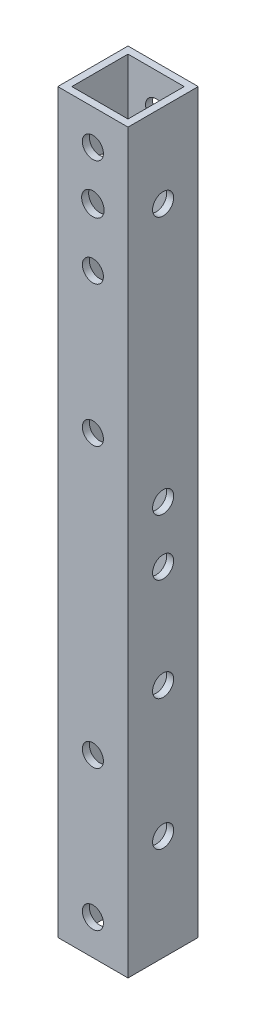
ISO-10303-21;
HEADER;
FILE_DESCRIPTION(('STEP AP214'),'2;1');
FILE_NAME('part.step','',(''),(''),'','','');
FILE_SCHEMA(('AUTOMOTIVE_DESIGN { 1 0 10303 214 1 1 1 1 }'));
ENDSEC;
DATA;
#1=APPLICATION_CONTEXT('core data for automotive mechanical design processes');
#2=APPLICATION_PROTOCOL_DEFINITION('international standard','automotive_design',2000,#1);
#3=PRODUCT_CONTEXT('',#1,'mechanical');
#4=PRODUCT('Part','Part','',(#3));
#5=PRODUCT_RELATED_PRODUCT_CATEGORY('part','',(#4));
#6=PRODUCT_DEFINITION_FORMATION('','',#4);
#7=PRODUCT_DEFINITION_CONTEXT('part definition',#1,'design');
#8=PRODUCT_DEFINITION('design','',#6,#7);
#9=PRODUCT_DEFINITION_SHAPE('','',#8);
#10=(LENGTH_UNIT() NAMED_UNIT(*) SI_UNIT(.MILLI.,.METRE.));
#11=(NAMED_UNIT(*) PLANE_ANGLE_UNIT() SI_UNIT($,.RADIAN.));
#12=(NAMED_UNIT(*) SI_UNIT($,.STERADIAN.) SOLID_ANGLE_UNIT());
#13=UNCERTAINTY_MEASURE_WITH_UNIT(LENGTH_MEASURE(1.E-05),#10,'distance_accuracy_value','');
#14=(GEOMETRIC_REPRESENTATION_CONTEXT(3) GLOBAL_UNCERTAINTY_ASSIGNED_CONTEXT((#13)) GLOBAL_UNIT_ASSIGNED_CONTEXT((#10,
#11,#12)) REPRESENTATION_CONTEXT('',''));
#15=CARTESIAN_POINT('',(0.,0.,0.));
#16=DIRECTION('',(0.,0.,1.));
#17=DIRECTION('',(1.,0.,0.));
#18=AXIS2_PLACEMENT_3D('',#15,#16,#17);
#19=CARTESIAN_POINT('',(0.,104.9,0.));
#20=DIRECTION('',(0.,1.,0.));
#21=DIRECTION('',(0.,0.,1.));
#22=AXIS2_PLACEMENT_3D('',#19,#20,#21);
#23=PLANE('',#22);
#24=DIRECTION('',(0.,0.,-1.));
#25=VECTOR('',#24,1.);
#26=CARTESIAN_POINT('',(5.,104.9,5.));
#27=LINE('',#26,#25);
#28=CARTESIAN_POINT('',(5.,104.9,5.));
#29=VERTEX_POINT('',#28);
#30=CARTESIAN_POINT('',(5.,104.9,-5.));
#31=VERTEX_POINT('',#30);
#32=EDGE_CURVE('E181',#29,#31,#27,.T.);
#33=ORIENTED_EDGE('',*,*,#32,.T.);
#34=DIRECTION('',(-1.,0.,0.));
#35=VECTOR('',#34,1.);
#36=CARTESIAN_POINT('',(-5.,104.9,-5.));
#37=LINE('',#36,#35);
#38=CARTESIAN_POINT('',(-5.,104.9,-5.));
#39=VERTEX_POINT('',#38);
#40=EDGE_CURVE('E185',#31,#39,#37,.T.);
#41=ORIENTED_EDGE('',*,*,#40,.T.);
#42=DIRECTION('',(0.,0.,1.));
#43=VECTOR('',#42,1.);
#44=CARTESIAN_POINT('',(-5.,104.9,5.));
#45=LINE('',#44,#43);
#46=CARTESIAN_POINT('',(-5.,104.9,5.));
#47=VERTEX_POINT('',#46);
#48=EDGE_CURVE('E189',#39,#47,#45,.T.);
#49=ORIENTED_EDGE('',*,*,#48,.T.);
#50=DIRECTION('',(1.,0.,0.));
#51=VECTOR('',#50,1.);
#52=CARTESIAN_POINT('',(-5.,104.9,5.));
#53=LINE('',#52,#51);
#54=EDGE_CURVE('E192',#47,#29,#53,.T.);
#55=ORIENTED_EDGE('',*,*,#54,.T.);
#56=EDGE_LOOP('',(#33,#41,#49,#55));
#57=FACE_BOUND('',#56,.T.);
#58=DIRECTION('',(-1.,0.,0.));
#59=VECTOR('',#58,1.);
#60=CARTESIAN_POINT('',(0.,104.9,-4.));
#61=LINE('',#60,#59);
#62=CARTESIAN_POINT('',(4.,104.9,-4.));
#63=VERTEX_POINT('',#62);
#64=CARTESIAN_POINT('',(-4.,104.9,-4.));
#65=VERTEX_POINT('',#64);
#66=EDGE_CURVE('E140',#63,#65,#61,.T.);
#67=ORIENTED_EDGE('',*,*,#66,.F.);
#68=DIRECTION('',(0.,0.,-1.));
#69=VECTOR('',#68,1.);
#70=CARTESIAN_POINT('',(4.,104.9,0.));
#71=LINE('',#70,#69);
#72=CARTESIAN_POINT('',(4.,104.9,4.));
#73=VERTEX_POINT('',#72);
#74=EDGE_CURVE('E131',#73,#63,#71,.T.);
#75=ORIENTED_EDGE('',*,*,#74,.F.);
#76=DIRECTION('',(1.,0.,0.));
#77=VECTOR('',#76,1.);
#78=CARTESIAN_POINT('',(0.,104.9,4.));
#79=LINE('',#78,#77);
#80=CARTESIAN_POINT('',(-4.,104.9,4.));
#81=VERTEX_POINT('',#80);
#82=EDGE_CURVE('E157',#81,#73,#79,.T.);
#83=ORIENTED_EDGE('',*,*,#82,.F.);
#84=DIRECTION('',(0.,0.,1.));
#85=VECTOR('',#84,1.);
#86=CARTESIAN_POINT('',(-4.,104.9,0.));
#87=LINE('',#86,#85);
#88=EDGE_CURVE('E153',#65,#81,#87,.T.);
#89=ORIENTED_EDGE('',*,*,#88,.F.);
#90=EDGE_LOOP('',(#67,#75,#83,#89));
#91=FACE_BOUND('',#90,.T.);
#92=ADVANCED_FACE('F63',(#57,#91),#23,.T.);
#93=CARTESIAN_POINT('',(0.,0.,0.));
#94=DIRECTION('',(0.,1.,0.));
#95=DIRECTION('',(0.,0.,1.));
#96=AXIS2_PLACEMENT_3D('',#93,#94,#95);
#97=PLANE('',#96);
#98=DIRECTION('',(0.,0.,-1.));
#99=VECTOR('',#98,1.);
#100=CARTESIAN_POINT('',(5.,0.,5.));
#101=LINE('',#100,#99);
#102=CARTESIAN_POINT('',(5.,0.,5.));
#103=VERTEX_POINT('',#102);
#104=CARTESIAN_POINT('',(5.,0.,-5.));
#105=VERTEX_POINT('',#104);
#106=EDGE_CURVE('E149',#103,#105,#101,.T.);
#107=ORIENTED_EDGE('',*,*,#106,.F.);
#108=DIRECTION('',(1.,0.,0.));
#109=VECTOR('',#108,1.);
#110=CARTESIAN_POINT('',(-5.,0.,5.));
#111=LINE('',#110,#109);
#112=CARTESIAN_POINT('',(-5.,0.,5.));
#113=VERTEX_POINT('',#112);
#114=EDGE_CURVE('E186',#113,#103,#111,.T.);
#115=ORIENTED_EDGE('',*,*,#114,.F.);
#116=DIRECTION('',(0.,0.,1.));
#117=VECTOR('',#116,1.);
#118=CARTESIAN_POINT('',(-5.,0.,5.));
#119=LINE('',#118,#117);
#120=CARTESIAN_POINT('',(-5.,0.,-5.));
#121=VERTEX_POINT('',#120);
#122=EDGE_CURVE('E202',#121,#113,#119,.T.);
#123=ORIENTED_EDGE('',*,*,#122,.F.);
#124=DIRECTION('',(-1.,0.,0.));
#125=VECTOR('',#124,1.);
#126=CARTESIAN_POINT('',(-5.,0.,-5.));
#127=LINE('',#126,#125);
#128=EDGE_CURVE('E199',#105,#121,#127,.T.);
#129=ORIENTED_EDGE('',*,*,#128,.F.);
#130=EDGE_LOOP('',(#107,#115,#123,#129));
#131=FACE_BOUND('',#130,.T.);
#132=DIRECTION('',(0.,0.,-1.));
#133=VECTOR('',#132,1.);
#134=CARTESIAN_POINT('',(4.,0.,0.));
#135=LINE('',#134,#133);
#136=CARTESIAN_POINT('',(4.,0.,4.));
#137=VERTEX_POINT('',#136);
#138=CARTESIAN_POINT('',(4.,0.,-4.));
#139=VERTEX_POINT('',#138);
#140=EDGE_CURVE('E89',#137,#139,#135,.T.);
#141=ORIENTED_EDGE('',*,*,#140,.T.);
#142=DIRECTION('',(-1.,0.,0.));
#143=VECTOR('',#142,1.);
#144=CARTESIAN_POINT('',(0.,0.,-4.));
#145=LINE('',#144,#143);
#146=CARTESIAN_POINT('',(-4.,0.,-4.));
#147=VERTEX_POINT('',#146);
#148=EDGE_CURVE('E147',#139,#147,#145,.T.);
#149=ORIENTED_EDGE('',*,*,#148,.T.);
#150=DIRECTION('',(0.,0.,1.));
#151=VECTOR('',#150,1.);
#152=CARTESIAN_POINT('',(-4.,0.,0.));
#153=LINE('',#152,#151);
#154=CARTESIAN_POINT('',(-4.,0.,4.));
#155=VERTEX_POINT('',#154);
#156=EDGE_CURVE('E168',#147,#155,#153,.T.);
#157=ORIENTED_EDGE('',*,*,#156,.T.);
#158=DIRECTION('',(1.,0.,0.));
#159=VECTOR('',#158,1.);
#160=CARTESIAN_POINT('',(0.,0.,4.));
#161=LINE('',#160,#159);
#162=EDGE_CURVE('E141',#155,#137,#161,.T.);
#163=ORIENTED_EDGE('',*,*,#162,.T.);
#164=EDGE_LOOP('',(#141,#149,#157,#163));
#165=FACE_BOUND('',#164,.T.);
#166=ADVANCED_FACE('F388',(#131,#165),#97,.F.);
#167=CARTESIAN_POINT('',(5.,104.9,5.));
#168=DIRECTION('',(-1.,0.,0.));
#169=DIRECTION('',(0.,0.,1.));
#170=AXIS2_PLACEMENT_3D('',#167,#168,#169);
#171=PLANE('',#170);
#172=CARTESIAN_POINT('',(5.,56.2,0.));
#173=DIRECTION('',(1.,0.,0.));
#174=DIRECTION('',(0.,0.,-1.));
#175=AXIS2_PLACEMENT_3D('',#172,#173,#174);
#176=CIRCLE('',#175,1.5);
#177=CARTESIAN_POINT('',(5.,56.2,-1.5));
#178=VERTEX_POINT('',#177);
#179=EDGE_CURVE('E479',#178,#178,#176,.T.);
#180=ORIENTED_EDGE('',*,*,#179,.F.);
#181=EDGE_LOOP('',(#180));
#182=FACE_BOUND('',#181,.T.);
#183=CARTESIAN_POINT('',(5.,15.,0.));
#184=DIRECTION('',(1.,0.,0.));
#185=DIRECTION('',(0.,0.,1.));
#186=AXIS2_PLACEMENT_3D('',#183,#184,#185);
#187=CIRCLE('',#186,1.5);
#188=CARTESIAN_POINT('',(5.,15.,1.5));
#189=VERTEX_POINT('',#188);
#190=EDGE_CURVE('E438',#189,#189,#187,.T.);
#191=ORIENTED_EDGE('',*,*,#190,.F.);
#192=EDGE_LOOP('',(#191));
#193=FACE_BOUND('',#192,.T.);
#194=CARTESIAN_POINT('',(5.,92.95,0.));
#195=DIRECTION('',(1.,0.,0.));
#196=DIRECTION('',(0.,0.,-1.));
#197=AXIS2_PLACEMENT_3D('',#194,#195,#196);
#198=CIRCLE('',#197,1.5);
#199=CARTESIAN_POINT('',(5.,92.95,-1.5));
#200=VERTEX_POINT('',#199);
#201=EDGE_CURVE('E473',#200,#200,#198,.T.);
#202=ORIENTED_EDGE('',*,*,#201,.F.);
#203=EDGE_LOOP('',(#202));
#204=FACE_BOUND('',#203,.T.);
#205=CARTESIAN_POINT('',(5.,33.6,0.));
#206=DIRECTION('',(1.,0.,0.));
#207=DIRECTION('',(0.,0.,-1.));
#208=AXIS2_PLACEMENT_3D('',#205,#206,#207);
#209=CIRCLE('',#208,1.5);
#210=CARTESIAN_POINT('',(5.,33.6,-1.5));
#211=VERTEX_POINT('',#210);
#212=EDGE_CURVE('E468',#211,#211,#209,.T.);
#213=ORIENTED_EDGE('',*,*,#212,.F.);
#214=EDGE_LOOP('',(#213));
#215=FACE_BOUND('',#214,.T.);
#216=CARTESIAN_POINT('',(5.,48.2,0.));
#217=DIRECTION('',(1.,0.,0.));
#218=DIRECTION('',(0.,0.,-1.));
#219=AXIS2_PLACEMENT_3D('',#216,#217,#218);
#220=CIRCLE('',#219,1.5);
#221=CARTESIAN_POINT('',(5.,48.2,-1.5));
#222=VERTEX_POINT('',#221);
#223=EDGE_CURVE('E432',#222,#222,#220,.T.);
#224=ORIENTED_EDGE('',*,*,#223,.F.);
#225=EDGE_LOOP('',(#224));
#226=FACE_BOUND('',#225,.T.);
#227=ORIENTED_EDGE('',*,*,#106,.T.);
#228=DIRECTION('',(0.,-1.,0.));
#229=VECTOR('',#228,1.);
#230=CARTESIAN_POINT('',(5.,104.9,-5.));
#231=LINE('',#230,#229);
#232=EDGE_CURVE('E12',#31,#105,#231,.T.);
#233=ORIENTED_EDGE('',*,*,#232,.F.);
#234=ORIENTED_EDGE('',*,*,#32,.F.);
#235=DIRECTION('',(0.,-1.,0.));
#236=VECTOR('',#235,1.);
#237=CARTESIAN_POINT('',(5.,104.9,5.));
#238=LINE('',#237,#236);
#239=EDGE_CURVE('E195',#29,#103,#238,.T.);
#240=ORIENTED_EDGE('',*,*,#239,.T.);
#241=EDGE_LOOP('',(#227,#233,#234,#240));
#242=FACE_BOUND('',#241,.T.);
#243=ADVANCED_FACE('F65',(#182,#193,#204,#215,#226,#242),#171,.F.);
#244=CARTESIAN_POINT('',(-5.,104.9,-5.));
#245=DIRECTION('',(0.,0.,1.));
#246=DIRECTION('',(1.,0.,0.));
#247=AXIS2_PLACEMENT_3D('',#244,#245,#246);
#248=PLANE('',#247);
#249=CARTESIAN_POINT('',(0.,5.00000000000002,-5.));
#250=DIRECTION('',(0.,0.,1.));
#251=DIRECTION('',(1.,0.,0.));
#252=AXIS2_PLACEMENT_3D('',#249,#250,#251);
#253=CIRCLE('',#252,1.5);
#254=CARTESIAN_POINT('',(1.5,5.00000000000002,-5.));
#255=VERTEX_POINT('',#254);
#256=EDGE_CURVE('E292',#255,#255,#253,.T.);
#257=ORIENTED_EDGE('',*,*,#256,.T.);
#258=EDGE_LOOP('',(#257));
#259=FACE_BOUND('',#258,.T.);
#260=CARTESIAN_POINT('',(0.,25.,-5.));
#261=DIRECTION('',(0.,0.,1.));
#262=DIRECTION('',(1.,0.,0.));
#263=AXIS2_PLACEMENT_3D('',#260,#261,#262);
#264=CIRCLE('',#263,1.5);
#265=CARTESIAN_POINT('',(1.5,25.,-5.));
#266=VERTEX_POINT('',#265);
#267=EDGE_CURVE('E301',#266,#266,#264,.T.);
#268=ORIENTED_EDGE('',*,*,#267,.T.);
#269=EDGE_LOOP('',(#268));
#270=FACE_BOUND('',#269,.T.);
#271=CARTESIAN_POINT('',(0.,64.7,-5.));
#272=DIRECTION('',(0.,0.,1.));
#273=DIRECTION('',(1.,0.,0.));
#274=AXIS2_PLACEMENT_3D('',#271,#272,#273);
#275=CIRCLE('',#274,1.5);
#276=CARTESIAN_POINT('',(1.5,64.7,-5.));
#277=VERTEX_POINT('',#276);
#278=EDGE_CURVE('E309',#277,#277,#275,.T.);
#279=ORIENTED_EDGE('',*,*,#278,.T.);
#280=EDGE_LOOP('',(#279));
#281=FACE_BOUND('',#280,.T.);
#282=CARTESIAN_POINT('',(0.,99.9,-5.));
#283=DIRECTION('',(0.,0.,1.));
#284=DIRECTION('',(1.,0.,0.));
#285=AXIS2_PLACEMENT_3D('',#282,#283,#284);
#286=CIRCLE('',#285,1.5);
#287=CARTESIAN_POINT('',(1.5,99.9,-5.));
#288=VERTEX_POINT('',#287);
#289=EDGE_CURVE('E317',#288,#288,#286,.T.);
#290=ORIENTED_EDGE('',*,*,#289,.T.);
#291=EDGE_LOOP('',(#290));
#292=FACE_BOUND('',#291,.T.);
#293=CARTESIAN_POINT('',(0.,92.95,-5.));
#294=DIRECTION('',(0.,0.,1.));
#295=DIRECTION('',(1.,0.,0.));
#296=AXIS2_PLACEMENT_3D('',#293,#294,#295);
#297=CIRCLE('',#296,1.6);
#298=CARTESIAN_POINT('',(1.6,92.95,-5.));
#299=VERTEX_POINT('',#298);
#300=EDGE_CURVE('E284',#299,#299,#297,.T.);
#301=ORIENTED_EDGE('',*,*,#300,.T.);
#302=EDGE_LOOP('',(#301));
#303=FACE_BOUND('',#302,.T.);
#304=CARTESIAN_POINT('',(0.,84.7,-5.));
#305=DIRECTION('',(0.,0.,1.));
#306=DIRECTION('',(1.,0.,0.));
#307=AXIS2_PLACEMENT_3D('',#304,#305,#306);
#308=CIRCLE('',#307,1.5);
#309=CARTESIAN_POINT('',(1.5,84.7,-5.));
#310=VERTEX_POINT('',#309);
#311=EDGE_CURVE('E222',#310,#310,#308,.T.);
#312=ORIENTED_EDGE('',*,*,#311,.T.);
#313=EDGE_LOOP('',(#312));
#314=FACE_BOUND('',#313,.T.);
#315=ORIENTED_EDGE('',*,*,#128,.T.);
#316=DIRECTION('',(0.,-1.,0.));
#317=VECTOR('',#316,1.);
#318=CARTESIAN_POINT('',(-5.,104.9,-5.));
#319=LINE('',#318,#317);
#320=EDGE_CURVE('E73',#39,#121,#319,.T.);
#321=ORIENTED_EDGE('',*,*,#320,.F.);
#322=ORIENTED_EDGE('',*,*,#40,.F.);
#323=ORIENTED_EDGE('',*,*,#232,.T.);
#324=EDGE_LOOP('',(#315,#321,#322,#323));
#325=FACE_BOUND('',#324,.T.);
#326=ADVANCED_FACE('F374',(#259,#270,#281,#292,#303,#314,#325),#248,.F.);
#327=CARTESIAN_POINT('',(-5.,104.9,5.));
#328=DIRECTION('',(1.,0.,0.));
#329=DIRECTION('',(0.,0.,-1.));
#330=AXIS2_PLACEMENT_3D('',#327,#328,#329);
#331=PLANE('',#330);
#332=CARTESIAN_POINT('',(-5.,56.2,0.));
#333=DIRECTION('',(1.,0.,0.));
#334=DIRECTION('',(0.,0.,-1.));
#335=AXIS2_PLACEMENT_3D('',#332,#333,#334);
#336=CIRCLE('',#335,1.5);
#337=CARTESIAN_POINT('',(-5.,56.2,-1.5));
#338=VERTEX_POINT('',#337);
#339=EDGE_CURVE('E415',#338,#338,#336,.T.);
#340=ORIENTED_EDGE('',*,*,#339,.T.);
#341=EDGE_LOOP('',(#340));
#342=FACE_BOUND('',#341,.T.);
#343=CARTESIAN_POINT('',(-5.,15.,0.));
#344=DIRECTION('',(1.,0.,0.));
#345=DIRECTION('',(0.,0.,1.));
#346=AXIS2_PLACEMENT_3D('',#343,#344,#345);
#347=CIRCLE('',#346,1.5);
#348=CARTESIAN_POINT('',(-5.,15.,1.5));
#349=VERTEX_POINT('',#348);
#350=EDGE_CURVE('E419',#349,#349,#347,.T.);
#351=ORIENTED_EDGE('',*,*,#350,.T.);
#352=EDGE_LOOP('',(#351));
#353=FACE_BOUND('',#352,.T.);
#354=CARTESIAN_POINT('',(-5.,92.95,0.));
#355=DIRECTION('',(1.,0.,0.));
#356=DIRECTION('',(0.,0.,-1.));
#357=AXIS2_PLACEMENT_3D('',#354,#355,#356);
#358=CIRCLE('',#357,1.5);
#359=CARTESIAN_POINT('',(-5.,92.95,-1.5));
#360=VERTEX_POINT('',#359);
#361=EDGE_CURVE('E423',#360,#360,#358,.T.);
#362=ORIENTED_EDGE('',*,*,#361,.T.);
#363=EDGE_LOOP('',(#362));
#364=FACE_BOUND('',#363,.T.);
#365=CARTESIAN_POINT('',(-5.,33.6,0.));
#366=DIRECTION('',(1.,0.,0.));
#367=DIRECTION('',(0.,0.,-1.));
#368=AXIS2_PLACEMENT_3D('',#365,#366,#367);
#369=CIRCLE('',#368,1.5);
#370=CARTESIAN_POINT('',(-5.,33.6,-1.5));
#371=VERTEX_POINT('',#370);
#372=EDGE_CURVE('E427',#371,#371,#369,.T.);
#373=ORIENTED_EDGE('',*,*,#372,.T.);
#374=EDGE_LOOP('',(#373));
#375=FACE_BOUND('',#374,.T.);
#376=CARTESIAN_POINT('',(-5.,48.2,0.));
#377=DIRECTION('',(1.,0.,0.));
#378=DIRECTION('',(0.,0.,-1.));
#379=AXIS2_PLACEMENT_3D('',#376,#377,#378);
#380=CIRCLE('',#379,1.5);
#381=CARTESIAN_POINT('',(-5.,48.2,-1.5));
#382=VERTEX_POINT('',#381);
#383=EDGE_CURVE('E252',#382,#382,#380,.T.);
#384=ORIENTED_EDGE('',*,*,#383,.T.);
#385=EDGE_LOOP('',(#384));
#386=FACE_BOUND('',#385,.T.);
#387=ORIENTED_EDGE('',*,*,#122,.T.);
#388=DIRECTION('',(0.,-1.,0.));
#389=VECTOR('',#388,1.);
#390=CARTESIAN_POINT('',(-5.,104.9,5.));
#391=LINE('',#390,#389);
#392=EDGE_CURVE('E210',#47,#113,#391,.T.);
#393=ORIENTED_EDGE('',*,*,#392,.F.);
#394=ORIENTED_EDGE('',*,*,#48,.F.);
#395=ORIENTED_EDGE('',*,*,#320,.T.);
#396=EDGE_LOOP('',(#387,#393,#394,#395));
#397=FACE_BOUND('',#396,.T.);
#398=ADVANCED_FACE('F377',(#342,#353,#364,#375,#386,#397),#331,.F.);
#399=CARTESIAN_POINT('',(-5.,104.9,5.));
#400=DIRECTION('',(0.,0.,-1.));
#401=DIRECTION('',(-1.,0.,0.));
#402=AXIS2_PLACEMENT_3D('',#399,#400,#401);
#403=PLANE('',#402);
#404=CARTESIAN_POINT('',(0.,5.00000000000002,5.));
#405=DIRECTION('',(0.,0.,1.));
#406=DIRECTION('',(1.,0.,0.));
#407=AXIS2_PLACEMENT_3D('',#404,#405,#406);
#408=CIRCLE('',#407,1.5);
#409=CARTESIAN_POINT('',(1.5,5.00000000000002,5.));
#410=VERTEX_POINT('',#409);
#411=EDGE_CURVE('E297',#410,#410,#408,.T.);
#412=ORIENTED_EDGE('',*,*,#411,.F.);
#413=EDGE_LOOP('',(#412));
#414=FACE_BOUND('',#413,.T.);
#415=CARTESIAN_POINT('',(0.,25.,5.));
#416=DIRECTION('',(0.,0.,1.));
#417=DIRECTION('',(1.,0.,0.));
#418=AXIS2_PLACEMENT_3D('',#415,#416,#417);
#419=CIRCLE('',#418,1.5);
#420=CARTESIAN_POINT('',(1.5,25.,5.));
#421=VERTEX_POINT('',#420);
#422=EDGE_CURVE('E305',#421,#421,#419,.T.);
#423=ORIENTED_EDGE('',*,*,#422,.F.);
#424=EDGE_LOOP('',(#423));
#425=FACE_BOUND('',#424,.T.);
#426=CARTESIAN_POINT('',(0.,64.7,5.));
#427=DIRECTION('',(0.,0.,1.));
#428=DIRECTION('',(1.,0.,0.));
#429=AXIS2_PLACEMENT_3D('',#426,#427,#428);
#430=CIRCLE('',#429,1.5);
#431=CARTESIAN_POINT('',(1.5,64.7,5.));
#432=VERTEX_POINT('',#431);
#433=EDGE_CURVE('E313',#432,#432,#430,.T.);
#434=ORIENTED_EDGE('',*,*,#433,.F.);
#435=EDGE_LOOP('',(#434));
#436=FACE_BOUND('',#435,.T.);
#437=CARTESIAN_POINT('',(0.,99.9,5.));
#438=DIRECTION('',(0.,0.,1.));
#439=DIRECTION('',(1.,0.,0.));
#440=AXIS2_PLACEMENT_3D('',#437,#438,#439);
#441=CIRCLE('',#440,1.5);
#442=CARTESIAN_POINT('',(1.5,99.9,5.));
#443=VERTEX_POINT('',#442);
#444=EDGE_CURVE('E288',#443,#443,#441,.T.);
#445=ORIENTED_EDGE('',*,*,#444,.F.);
#446=EDGE_LOOP('',(#445));
#447=FACE_BOUND('',#446,.T.);
#448=CARTESIAN_POINT('',(0.,92.95,5.));
#449=DIRECTION('',(0.,0.,1.));
#450=DIRECTION('',(1.,0.,0.));
#451=AXIS2_PLACEMENT_3D('',#448,#449,#450);
#452=CIRCLE('',#451,1.6);
#453=CARTESIAN_POINT('',(1.6,92.95,5.));
#454=VERTEX_POINT('',#453);
#455=EDGE_CURVE('E283',#454,#454,#452,.T.);
#456=ORIENTED_EDGE('',*,*,#455,.F.);
#457=EDGE_LOOP('',(#456));
#458=FACE_BOUND('',#457,.T.);
#459=CARTESIAN_POINT('',(0.,84.7,5.));
#460=DIRECTION('',(0.,0.,1.));
#461=DIRECTION('',(1.,0.,0.));
#462=AXIS2_PLACEMENT_3D('',#459,#460,#461);
#463=CIRCLE('',#462,1.5);
#464=CARTESIAN_POINT('',(1.5,84.7,5.));
#465=VERTEX_POINT('',#464);
#466=EDGE_CURVE('E296',#465,#465,#463,.T.);
#467=ORIENTED_EDGE('',*,*,#466,.F.);
#468=EDGE_LOOP('',(#467));
#469=FACE_BOUND('',#468,.T.);
#470=ORIENTED_EDGE('',*,*,#114,.T.);
#471=ORIENTED_EDGE('',*,*,#239,.F.);
#472=ORIENTED_EDGE('',*,*,#54,.F.);
#473=ORIENTED_EDGE('',*,*,#392,.T.);
#474=EDGE_LOOP('',(#470,#471,#472,#473));
#475=FACE_BOUND('',#474,.T.);
#476=ADVANCED_FACE('F392',(#414,#425,#436,#447,#458,#469,#475),#403,.F.);
#477=CARTESIAN_POINT('',(4.,104.9,0.));
#478=DIRECTION('',(-1.,0.,0.));
#479=DIRECTION('',(0.,0.,1.));
#480=AXIS2_PLACEMENT_3D('',#477,#478,#479);
#481=PLANE('',#480);
#482=CARTESIAN_POINT('',(4.,56.2,0.));
#483=DIRECTION('',(-1.,0.,0.));
#484=DIRECTION('',(0.,0.,1.));
#485=AXIS2_PLACEMENT_3D('',#482,#483,#484);
#486=CIRCLE('',#485,1.5);
#487=CARTESIAN_POINT('',(4.,56.2,1.5));
#488=VERTEX_POINT('',#487);
#489=EDGE_CURVE('E279',#488,#488,#486,.T.);
#490=ORIENTED_EDGE('',*,*,#489,.F.);
#491=EDGE_LOOP('',(#490));
#492=FACE_BOUND('',#491,.T.);
#493=CARTESIAN_POINT('',(4.,15.,0.));
#494=DIRECTION('',(-1.,0.,0.));
#495=DIRECTION('',(0.,0.,1.));
#496=AXIS2_PLACEMENT_3D('',#493,#494,#495);
#497=CIRCLE('',#496,1.5);
#498=CARTESIAN_POINT('',(4.,15.,1.5));
#499=VERTEX_POINT('',#498);
#500=EDGE_CURVE('E265',#499,#499,#497,.T.);
#501=ORIENTED_EDGE('',*,*,#500,.F.);
#502=EDGE_LOOP('',(#501));
#503=FACE_BOUND('',#502,.T.);
#504=CARTESIAN_POINT('',(4.,92.95,0.));
#505=DIRECTION('',(-1.,0.,0.));
#506=DIRECTION('',(0.,0.,1.));
#507=AXIS2_PLACEMENT_3D('',#504,#505,#506);
#508=CIRCLE('',#507,1.5);
#509=CARTESIAN_POINT('',(4.,92.95,1.5));
#510=VERTEX_POINT('',#509);
#511=EDGE_CURVE('E261',#510,#510,#508,.T.);
#512=ORIENTED_EDGE('',*,*,#511,.F.);
#513=EDGE_LOOP('',(#512));
#514=FACE_BOUND('',#513,.T.);
#515=CARTESIAN_POINT('',(4.,33.6,0.));
#516=DIRECTION('',(-1.,0.,0.));
#517=DIRECTION('',(0.,0.,1.));
#518=AXIS2_PLACEMENT_3D('',#515,#516,#517);
#519=CIRCLE('',#518,1.5);
#520=CARTESIAN_POINT('',(4.,33.6,1.5));
#521=VERTEX_POINT('',#520);
#522=EDGE_CURVE('E257',#521,#521,#519,.T.);
#523=ORIENTED_EDGE('',*,*,#522,.F.);
#524=EDGE_LOOP('',(#523));
#525=FACE_BOUND('',#524,.T.);
#526=CARTESIAN_POINT('',(4.,48.2,0.));
#527=DIRECTION('',(-1.,0.,0.));
#528=DIRECTION('',(0.,0.,1.));
#529=AXIS2_PLACEMENT_3D('',#526,#527,#528);
#530=CIRCLE('',#529,1.5);
#531=CARTESIAN_POINT('',(4.,48.2,1.5));
#532=VERTEX_POINT('',#531);
#533=EDGE_CURVE('E251',#532,#532,#530,.T.);
#534=ORIENTED_EDGE('',*,*,#533,.F.);
#535=EDGE_LOOP('',(#534));
#536=FACE_BOUND('',#535,.T.);
#537=ORIENTED_EDGE('',*,*,#140,.F.);
#538=DIRECTION('',(0.,-1.,0.));
#539=VECTOR('',#538,1.);
#540=CARTESIAN_POINT('',(4.,104.9,4.));
#541=LINE('',#540,#539);
#542=EDGE_CURVE('E135',#73,#137,#541,.T.);
#543=ORIENTED_EDGE('',*,*,#542,.F.);
#544=ORIENTED_EDGE('',*,*,#74,.T.);
#545=DIRECTION('',(0.,-1.,0.));
#546=VECTOR('',#545,1.);
#547=CARTESIAN_POINT('',(4.,104.9,-4.));
#548=LINE('',#547,#546);
#549=EDGE_CURVE('E134',#63,#139,#548,.T.);
#550=ORIENTED_EDGE('',*,*,#549,.T.);
#551=EDGE_LOOP('',(#537,#543,#544,#550));
#552=FACE_BOUND('',#551,.T.);
#553=ADVANCED_FACE('F133',(#492,#503,#514,#525,#536,#552),#481,.T.);
#554=CARTESIAN_POINT('',(0.,104.9,-4.));
#555=DIRECTION('',(0.,0.,1.));
#556=DIRECTION('',(1.,0.,0.));
#557=AXIS2_PLACEMENT_3D('',#554,#555,#556);
#558=PLANE('',#557);
#559=CARTESIAN_POINT('',(0.,5.00000000000002,-4.));
#560=DIRECTION('',(0.,0.,1.));
#561=DIRECTION('',(1.,0.,0.));
#562=AXIS2_PLACEMENT_3D('',#559,#560,#561);
#563=CIRCLE('',#562,1.5);
#564=CARTESIAN_POINT('',(1.5,5.00000000000002,-4.));
#565=VERTEX_POINT('',#564);
#566=EDGE_CURVE('E165',#565,#565,#563,.T.);
#567=ORIENTED_EDGE('',*,*,#566,.F.);
#568=EDGE_LOOP('',(#567));
#569=FACE_BOUND('',#568,.T.);
#570=CARTESIAN_POINT('',(0.,25.,-4.));
#571=DIRECTION('',(0.,0.,1.));
#572=DIRECTION('',(1.,0.,0.));
#573=AXIS2_PLACEMENT_3D('',#570,#571,#572);
#574=CIRCLE('',#573,1.5);
#575=CARTESIAN_POINT('',(1.5,25.,-4.));
#576=VERTEX_POINT('',#575);
#577=EDGE_CURVE('E242',#576,#576,#574,.T.);
#578=ORIENTED_EDGE('',*,*,#577,.F.);
#579=EDGE_LOOP('',(#578));
#580=FACE_BOUND('',#579,.T.);
#581=CARTESIAN_POINT('',(0.,64.7,-4.));
#582=DIRECTION('',(0.,0.,1.));
#583=DIRECTION('',(1.,0.,0.));
#584=AXIS2_PLACEMENT_3D('',#581,#582,#583);
#585=CIRCLE('',#584,1.5);
#586=CARTESIAN_POINT('',(1.5,64.7,-4.));
#587=VERTEX_POINT('',#586);
#588=EDGE_CURVE('E237',#587,#587,#585,.T.);
#589=ORIENTED_EDGE('',*,*,#588,.F.);
#590=EDGE_LOOP('',(#589));
#591=FACE_BOUND('',#590,.T.);
#592=CARTESIAN_POINT('',(0.,99.9,-4.));
#593=DIRECTION('',(0.,0.,1.));
#594=DIRECTION('',(1.,0.,0.));
#595=AXIS2_PLACEMENT_3D('',#592,#593,#594);
#596=CIRCLE('',#595,1.5);
#597=CARTESIAN_POINT('',(1.5,99.9,-4.));
#598=VERTEX_POINT('',#597);
#599=EDGE_CURVE('E232',#598,#598,#596,.T.);
#600=ORIENTED_EDGE('',*,*,#599,.F.);
#601=EDGE_LOOP('',(#600));
#602=FACE_BOUND('',#601,.T.);
#603=CARTESIAN_POINT('',(0.,92.95,-4.));
#604=DIRECTION('',(0.,0.,1.));
#605=DIRECTION('',(1.,0.,0.));
#606=AXIS2_PLACEMENT_3D('',#603,#604,#605);
#607=CIRCLE('',#606,1.6);
#608=CARTESIAN_POINT('',(1.6,92.95,-4.));
#609=VERTEX_POINT('',#608);
#610=EDGE_CURVE('E227',#609,#609,#607,.T.);
#611=ORIENTED_EDGE('',*,*,#610,.F.);
#612=EDGE_LOOP('',(#611));
#613=FACE_BOUND('',#612,.T.);
#614=CARTESIAN_POINT('',(0.,84.7,-4.));
#615=DIRECTION('',(0.,0.,1.));
#616=DIRECTION('',(1.,0.,0.));
#617=AXIS2_PLACEMENT_3D('',#614,#615,#616);
#618=CIRCLE('',#617,1.5);
#619=CARTESIAN_POINT('',(1.5,84.7,-4.));
#620=VERTEX_POINT('',#619);
#621=EDGE_CURVE('E221',#620,#620,#618,.T.);
#622=ORIENTED_EDGE('',*,*,#621,.F.);
#623=EDGE_LOOP('',(#622));
#624=FACE_BOUND('',#623,.T.);
#625=ORIENTED_EDGE('',*,*,#148,.F.);
#626=ORIENTED_EDGE('',*,*,#549,.F.);
#627=ORIENTED_EDGE('',*,*,#66,.T.);
#628=DIRECTION('',(0.,-1.,0.));
#629=VECTOR('',#628,1.);
#630=CARTESIAN_POINT('',(-4.,104.9,-4.));
#631=LINE('',#630,#629);
#632=EDGE_CURVE('E150',#65,#147,#631,.T.);
#633=ORIENTED_EDGE('',*,*,#632,.T.);
#634=EDGE_LOOP('',(#625,#626,#627,#633));
#635=FACE_BOUND('',#634,.T.);
#636=ADVANCED_FACE('F144',(#569,#580,#591,#602,#613,#624,#635),#558,.T.);
#637=CARTESIAN_POINT('',(-4.,104.9,0.));
#638=DIRECTION('',(1.,0.,0.));
#639=DIRECTION('',(0.,0.,-1.));
#640=AXIS2_PLACEMENT_3D('',#637,#638,#639);
#641=PLANE('',#640);
#642=CARTESIAN_POINT('',(-4.,56.2,0.));
#643=DIRECTION('',(1.,0.,0.));
#644=DIRECTION('',(0.,0.,-1.));
#645=AXIS2_PLACEMENT_3D('',#642,#643,#644);
#646=CIRCLE('',#645,1.5);
#647=CARTESIAN_POINT('',(-4.,56.2,-1.5));
#648=VERTEX_POINT('',#647);
#649=EDGE_CURVE('E67',#648,#648,#646,.T.);
#650=ORIENTED_EDGE('',*,*,#649,.F.);
#651=EDGE_LOOP('',(#650));
#652=FACE_BOUND('',#651,.T.);
#653=CARTESIAN_POINT('',(-4.,15.,0.));
#654=DIRECTION('',(1.,0.,0.));
#655=DIRECTION('',(0.,0.,-1.));
#656=AXIS2_PLACEMENT_3D('',#653,#654,#655);
#657=CIRCLE('',#656,1.5);
#658=CARTESIAN_POINT('',(-4.,15.,-1.5));
#659=VERTEX_POINT('',#658);
#660=EDGE_CURVE('E262',#659,#659,#657,.T.);
#661=ORIENTED_EDGE('',*,*,#660,.F.);
#662=EDGE_LOOP('',(#661));
#663=FACE_BOUND('',#662,.T.);
#664=CARTESIAN_POINT('',(-4.,92.95,0.));
#665=DIRECTION('',(1.,0.,0.));
#666=DIRECTION('',(0.,0.,-1.));
#667=AXIS2_PLACEMENT_3D('',#664,#665,#666);
#668=CIRCLE('',#667,1.5);
#669=CARTESIAN_POINT('',(-4.,92.95,-1.5));
#670=VERTEX_POINT('',#669);
#671=EDGE_CURVE('E258',#670,#670,#668,.T.);
#672=ORIENTED_EDGE('',*,*,#671,.F.);
#673=EDGE_LOOP('',(#672));
#674=FACE_BOUND('',#673,.T.);
#675=CARTESIAN_POINT('',(-4.,33.6,0.));
#676=DIRECTION('',(1.,0.,0.));
#677=DIRECTION('',(0.,0.,-1.));
#678=AXIS2_PLACEMENT_3D('',#675,#676,#677);
#679=CIRCLE('',#678,1.5);
#680=CARTESIAN_POINT('',(-4.,33.6,-1.5));
#681=VERTEX_POINT('',#680);
#682=EDGE_CURVE('E253',#681,#681,#679,.T.);
#683=ORIENTED_EDGE('',*,*,#682,.F.);
#684=EDGE_LOOP('',(#683));
#685=FACE_BOUND('',#684,.T.);
#686=CARTESIAN_POINT('',(-4.,48.2,0.));
#687=DIRECTION('',(1.,0.,0.));
#688=DIRECTION('',(0.,0.,-1.));
#689=AXIS2_PLACEMENT_3D('',#686,#687,#688);
#690=CIRCLE('',#689,1.5);
#691=CARTESIAN_POINT('',(-4.,48.2,-1.5));
#692=VERTEX_POINT('',#691);
#693=EDGE_CURVE('E247',#692,#692,#690,.T.);
#694=ORIENTED_EDGE('',*,*,#693,.F.);
#695=EDGE_LOOP('',(#694));
#696=FACE_BOUND('',#695,.T.);
#697=ORIENTED_EDGE('',*,*,#156,.F.);
#698=ORIENTED_EDGE('',*,*,#632,.F.);
#699=ORIENTED_EDGE('',*,*,#88,.T.);
#700=DIRECTION('',(0.,-1.,0.));
#701=VECTOR('',#700,1.);
#702=CARTESIAN_POINT('',(-4.,104.9,4.));
#703=LINE('',#702,#701);
#704=EDGE_CURVE('E81',#81,#155,#703,.T.);
#705=ORIENTED_EDGE('',*,*,#704,.T.);
#706=EDGE_LOOP('',(#697,#698,#699,#705));
#707=FACE_BOUND('',#706,.T.);
#708=ADVANCED_FACE('F353',(#652,#663,#674,#685,#696,#707),#641,.T.);
#709=CARTESIAN_POINT('',(0.,104.9,4.));
#710=DIRECTION('',(0.,0.,-1.));
#711=DIRECTION('',(-1.,0.,0.));
#712=AXIS2_PLACEMENT_3D('',#709,#710,#711);
#713=PLANE('',#712);
#714=CARTESIAN_POINT('',(0.,5.00000000000002,4.));
#715=DIRECTION('',(0.,0.,-1.));
#716=DIRECTION('',(-1.,0.,0.));
#717=AXIS2_PLACEMENT_3D('',#714,#715,#716);
#718=CIRCLE('',#717,1.5);
#719=CARTESIAN_POINT('',(-1.5,5.00000000000002,4.));
#720=VERTEX_POINT('',#719);
#721=EDGE_CURVE('E243',#720,#720,#718,.T.);
#722=ORIENTED_EDGE('',*,*,#721,.F.);
#723=EDGE_LOOP('',(#722));
#724=FACE_BOUND('',#723,.T.);
#725=CARTESIAN_POINT('',(0.,25.,4.));
#726=DIRECTION('',(0.,0.,-1.));
#727=DIRECTION('',(-1.,0.,0.));
#728=AXIS2_PLACEMENT_3D('',#725,#726,#727);
#729=CIRCLE('',#728,1.5);
#730=CARTESIAN_POINT('',(-1.5,25.,4.));
#731=VERTEX_POINT('',#730);
#732=EDGE_CURVE('E238',#731,#731,#729,.T.);
#733=ORIENTED_EDGE('',*,*,#732,.F.);
#734=EDGE_LOOP('',(#733));
#735=FACE_BOUND('',#734,.T.);
#736=CARTESIAN_POINT('',(0.,64.7,4.));
#737=DIRECTION('',(0.,0.,-1.));
#738=DIRECTION('',(-1.,0.,0.));
#739=AXIS2_PLACEMENT_3D('',#736,#737,#738);
#740=CIRCLE('',#739,1.5);
#741=CARTESIAN_POINT('',(-1.5,64.7,4.));
#742=VERTEX_POINT('',#741);
#743=EDGE_CURVE('E233',#742,#742,#740,.T.);
#744=ORIENTED_EDGE('',*,*,#743,.F.);
#745=EDGE_LOOP('',(#744));
#746=FACE_BOUND('',#745,.T.);
#747=CARTESIAN_POINT('',(0.,99.9,4.));
#748=DIRECTION('',(0.,0.,-1.));
#749=DIRECTION('',(-1.,0.,0.));
#750=AXIS2_PLACEMENT_3D('',#747,#748,#749);
#751=CIRCLE('',#750,1.5);
#752=CARTESIAN_POINT('',(-1.5,99.9,4.));
#753=VERTEX_POINT('',#752);
#754=EDGE_CURVE('E228',#753,#753,#751,.T.);
#755=ORIENTED_EDGE('',*,*,#754,.F.);
#756=EDGE_LOOP('',(#755));
#757=FACE_BOUND('',#756,.T.);
#758=CARTESIAN_POINT('',(0.,92.95,4.));
#759=DIRECTION('',(0.,0.,-1.));
#760=DIRECTION('',(-1.,0.,0.));
#761=AXIS2_PLACEMENT_3D('',#758,#759,#760);
#762=CIRCLE('',#761,1.6);
#763=CARTESIAN_POINT('',(-1.6,92.95,4.));
#764=VERTEX_POINT('',#763);
#765=EDGE_CURVE('E223',#764,#764,#762,.T.);
#766=ORIENTED_EDGE('',*,*,#765,.F.);
#767=EDGE_LOOP('',(#766));
#768=FACE_BOUND('',#767,.T.);
#769=CARTESIAN_POINT('',(0.,84.7,4.));
#770=DIRECTION('',(0.,0.,-1.));
#771=DIRECTION('',(-1.,0.,0.));
#772=AXIS2_PLACEMENT_3D('',#769,#770,#771);
#773=CIRCLE('',#772,1.5);
#774=CARTESIAN_POINT('',(-1.5,84.7,4.));
#775=VERTEX_POINT('',#774);
#776=EDGE_CURVE('E217',#775,#775,#773,.T.);
#777=ORIENTED_EDGE('',*,*,#776,.F.);
#778=EDGE_LOOP('',(#777));
#779=FACE_BOUND('',#778,.T.);
#780=ORIENTED_EDGE('',*,*,#162,.F.);
#781=ORIENTED_EDGE('',*,*,#704,.F.);
#782=ORIENTED_EDGE('',*,*,#82,.T.);
#783=ORIENTED_EDGE('',*,*,#542,.T.);
#784=EDGE_LOOP('',(#780,#781,#782,#783));
#785=FACE_BOUND('',#784,.T.);
#786=ADVANCED_FACE('F525',(#724,#735,#746,#757,#768,#779,#785),#713,.T.);
#787=CARTESIAN_POINT('',(0.,84.7,-5.));
#788=DIRECTION('',(0.,0.,1.));
#789=DIRECTION('',(1.,0.,0.));
#790=AXIS2_PLACEMENT_3D('',#787,#788,#789);
#791=CYLINDRICAL_SURFACE('',#790,1.5);
#792=ORIENTED_EDGE('',*,*,#776,.T.);
#793=EDGE_LOOP('',(#792));
#794=FACE_BOUND('',#793,.T.);
#795=ORIENTED_EDGE('',*,*,#466,.T.);
#796=EDGE_LOOP('',(#795));
#797=FACE_BOUND('',#796,.T.);
#798=ADVANCED_FACE('F371',(#794,#797),#791,.F.);
#799=CARTESIAN_POINT('',(0.,92.95,-5.));
#800=DIRECTION('',(0.,0.,1.));
#801=DIRECTION('',(1.,0.,0.));
#802=AXIS2_PLACEMENT_3D('',#799,#800,#801);
#803=CYLINDRICAL_SURFACE('',#802,1.6);
#804=ORIENTED_EDGE('',*,*,#765,.T.);
#805=EDGE_LOOP('',(#804));
#806=FACE_BOUND('',#805,.T.);
#807=ORIENTED_EDGE('',*,*,#455,.T.);
#808=EDGE_LOOP('',(#807));
#809=FACE_BOUND('',#808,.T.);
#810=ADVANCED_FACE('F535',(#806,#809),#803,.F.);
#811=CARTESIAN_POINT('',(0.,99.9,-5.));
#812=DIRECTION('',(0.,0.,1.));
#813=DIRECTION('',(1.,0.,0.));
#814=AXIS2_PLACEMENT_3D('',#811,#812,#813);
#815=CYLINDRICAL_SURFACE('',#814,1.5);
#816=ORIENTED_EDGE('',*,*,#754,.T.);
#817=EDGE_LOOP('',(#816));
#818=FACE_BOUND('',#817,.T.);
#819=ORIENTED_EDGE('',*,*,#444,.T.);
#820=EDGE_LOOP('',(#819));
#821=FACE_BOUND('',#820,.T.);
#822=ADVANCED_FACE('F540',(#818,#821),#815,.F.);
#823=CARTESIAN_POINT('',(0.,64.7,-5.));
#824=DIRECTION('',(0.,0.,1.));
#825=DIRECTION('',(1.,0.,0.));
#826=AXIS2_PLACEMENT_3D('',#823,#824,#825);
#827=CYLINDRICAL_SURFACE('',#826,1.5);
#828=ORIENTED_EDGE('',*,*,#743,.T.);
#829=EDGE_LOOP('',(#828));
#830=FACE_BOUND('',#829,.T.);
#831=ORIENTED_EDGE('',*,*,#433,.T.);
#832=EDGE_LOOP('',(#831));
#833=FACE_BOUND('',#832,.T.);
#834=ADVANCED_FACE('F543',(#830,#833),#827,.F.);
#835=CARTESIAN_POINT('',(0.,25.,-5.));
#836=DIRECTION('',(0.,0.,1.));
#837=DIRECTION('',(1.,0.,0.));
#838=AXIS2_PLACEMENT_3D('',#835,#836,#837);
#839=CYLINDRICAL_SURFACE('',#838,1.5);
#840=ORIENTED_EDGE('',*,*,#732,.T.);
#841=EDGE_LOOP('',(#840));
#842=FACE_BOUND('',#841,.T.);
#843=ORIENTED_EDGE('',*,*,#422,.T.);
#844=EDGE_LOOP('',(#843));
#845=FACE_BOUND('',#844,.T.);
#846=ADVANCED_FACE('F548',(#842,#845),#839,.F.);
#847=CARTESIAN_POINT('',(0.,5.00000000000002,-5.));
#848=DIRECTION('',(0.,0.,1.));
#849=DIRECTION('',(1.,0.,0.));
#850=AXIS2_PLACEMENT_3D('',#847,#848,#849);
#851=CYLINDRICAL_SURFACE('',#850,1.5);
#852=ORIENTED_EDGE('',*,*,#721,.T.);
#853=EDGE_LOOP('',(#852));
#854=FACE_BOUND('',#853,.T.);
#855=ORIENTED_EDGE('',*,*,#411,.T.);
#856=EDGE_LOOP('',(#855));
#857=FACE_BOUND('',#856,.T.);
#858=ADVANCED_FACE('F369',(#854,#857),#851,.F.);
#859=ORIENTED_EDGE('',*,*,#621,.T.);
#860=EDGE_LOOP('',(#859));
#861=FACE_BOUND('',#860,.T.);
#862=ORIENTED_EDGE('',*,*,#311,.F.);
#863=EDGE_LOOP('',(#862));
#864=FACE_BOUND('',#863,.T.);
#865=ADVANCED_FACE('F365',(#861,#864),#791,.F.);
#866=ORIENTED_EDGE('',*,*,#610,.T.);
#867=EDGE_LOOP('',(#866));
#868=FACE_BOUND('',#867,.T.);
#869=ORIENTED_EDGE('',*,*,#300,.F.);
#870=EDGE_LOOP('',(#869));
#871=FACE_BOUND('',#870,.T.);
#872=ADVANCED_FACE('F368',(#868,#871),#803,.F.);
#873=ORIENTED_EDGE('',*,*,#599,.T.);
#874=EDGE_LOOP('',(#873));
#875=FACE_BOUND('',#874,.T.);
#876=ORIENTED_EDGE('',*,*,#289,.F.);
#877=EDGE_LOOP('',(#876));
#878=FACE_BOUND('',#877,.T.);
#879=ADVANCED_FACE('F545',(#875,#878),#815,.F.);
#880=ORIENTED_EDGE('',*,*,#588,.T.);
#881=EDGE_LOOP('',(#880));
#882=FACE_BOUND('',#881,.T.);
#883=ORIENTED_EDGE('',*,*,#278,.F.);
#884=EDGE_LOOP('',(#883));
#885=FACE_BOUND('',#884,.T.);
#886=ADVANCED_FACE('F550',(#882,#885),#827,.F.);
#887=ORIENTED_EDGE('',*,*,#577,.T.);
#888=EDGE_LOOP('',(#887));
#889=FACE_BOUND('',#888,.T.);
#890=ORIENTED_EDGE('',*,*,#267,.F.);
#891=EDGE_LOOP('',(#890));
#892=FACE_BOUND('',#891,.T.);
#893=ADVANCED_FACE('F519',(#889,#892),#839,.F.);
#894=ORIENTED_EDGE('',*,*,#566,.T.);
#895=EDGE_LOOP('',(#894));
#896=FACE_BOUND('',#895,.T.);
#897=ORIENTED_EDGE('',*,*,#256,.F.);
#898=EDGE_LOOP('',(#897));
#899=FACE_BOUND('',#898,.T.);
#900=ADVANCED_FACE('F348',(#896,#899),#851,.F.);
#901=CARTESIAN_POINT('',(-5.,48.2,0.));
#902=DIRECTION('',(1.,0.,0.));
#903=DIRECTION('',(0.,0.,-1.));
#904=AXIS2_PLACEMENT_3D('',#901,#902,#903);
#905=CYLINDRICAL_SURFACE('',#904,1.5);
#906=ORIENTED_EDGE('',*,*,#693,.T.);
#907=EDGE_LOOP('',(#906));
#908=FACE_BOUND('',#907,.T.);
#909=ORIENTED_EDGE('',*,*,#383,.F.);
#910=EDGE_LOOP('',(#909));
#911=FACE_BOUND('',#910,.T.);
#912=ADVANCED_FACE('F501',(#908,#911),#905,.F.);
#913=CARTESIAN_POINT('',(-5.,33.6,0.));
#914=DIRECTION('',(1.,0.,0.));
#915=DIRECTION('',(0.,0.,-1.));
#916=AXIS2_PLACEMENT_3D('',#913,#914,#915);
#917=CYLINDRICAL_SURFACE('',#916,1.5);
#918=ORIENTED_EDGE('',*,*,#682,.T.);
#919=EDGE_LOOP('',(#918));
#920=FACE_BOUND('',#919,.T.);
#921=ORIENTED_EDGE('',*,*,#372,.F.);
#922=EDGE_LOOP('',(#921));
#923=FACE_BOUND('',#922,.T.);
#924=ADVANCED_FACE('F465',(#920,#923),#917,.F.);
#925=CARTESIAN_POINT('',(-5.,92.95,0.));
#926=DIRECTION('',(1.,0.,0.));
#927=DIRECTION('',(0.,0.,-1.));
#928=AXIS2_PLACEMENT_3D('',#925,#926,#927);
#929=CYLINDRICAL_SURFACE('',#928,1.5);
#930=ORIENTED_EDGE('',*,*,#671,.T.);
#931=EDGE_LOOP('',(#930));
#932=FACE_BOUND('',#931,.T.);
#933=ORIENTED_EDGE('',*,*,#361,.F.);
#934=EDGE_LOOP('',(#933));
#935=FACE_BOUND('',#934,.T.);
#936=ADVANCED_FACE('F517',(#932,#935),#929,.F.);
#937=CARTESIAN_POINT('',(-5.,15.,0.));
#938=DIRECTION('',(1.,0.,0.));
#939=DIRECTION('',(0.,0.,-1.));
#940=AXIS2_PLACEMENT_3D('',#937,#938,#939);
#941=CYLINDRICAL_SURFACE('',#940,1.5);
#942=ORIENTED_EDGE('',*,*,#660,.T.);
#943=EDGE_LOOP('',(#942));
#944=FACE_BOUND('',#943,.T.);
#945=ORIENTED_EDGE('',*,*,#350,.F.);
#946=EDGE_LOOP('',(#945));
#947=FACE_BOUND('',#946,.T.);
#948=ADVANCED_FACE('F505',(#944,#947),#941,.F.);
#949=CARTESIAN_POINT('',(-5.,56.2,0.));
#950=DIRECTION('',(1.,0.,0.));
#951=DIRECTION('',(0.,0.,-1.));
#952=AXIS2_PLACEMENT_3D('',#949,#950,#951);
#953=CYLINDRICAL_SURFACE('',#952,1.5);
#954=ORIENTED_EDGE('',*,*,#649,.T.);
#955=EDGE_LOOP('',(#954));
#956=FACE_BOUND('',#955,.T.);
#957=ORIENTED_EDGE('',*,*,#339,.F.);
#958=EDGE_LOOP('',(#957));
#959=FACE_BOUND('',#958,.T.);
#960=ADVANCED_FACE('F499',(#956,#959),#953,.F.);
#961=ORIENTED_EDGE('',*,*,#533,.T.);
#962=EDGE_LOOP('',(#961));
#963=FACE_BOUND('',#962,.T.);
#964=ORIENTED_EDGE('',*,*,#223,.T.);
#965=EDGE_LOOP('',(#964));
#966=FACE_BOUND('',#965,.T.);
#967=ADVANCED_FACE('F444',(#963,#966),#905,.F.);
#968=ORIENTED_EDGE('',*,*,#522,.T.);
#969=EDGE_LOOP('',(#968));
#970=FACE_BOUND('',#969,.T.);
#971=ORIENTED_EDGE('',*,*,#212,.T.);
#972=EDGE_LOOP('',(#971));
#973=FACE_BOUND('',#972,.T.);
#974=ADVANCED_FACE('F460',(#970,#973),#917,.F.);
#975=ORIENTED_EDGE('',*,*,#511,.T.);
#976=EDGE_LOOP('',(#975));
#977=FACE_BOUND('',#976,.T.);
#978=ORIENTED_EDGE('',*,*,#201,.T.);
#979=EDGE_LOOP('',(#978));
#980=FACE_BOUND('',#979,.T.);
#981=ADVANCED_FACE('F463',(#977,#980),#929,.F.);
#982=ORIENTED_EDGE('',*,*,#500,.T.);
#983=EDGE_LOOP('',(#982));
#984=FACE_BOUND('',#983,.T.);
#985=ORIENTED_EDGE('',*,*,#190,.T.);
#986=EDGE_LOOP('',(#985));
#987=FACE_BOUND('',#986,.T.);
#988=ADVANCED_FACE('F645',(#984,#987),#941,.F.);
#989=ORIENTED_EDGE('',*,*,#489,.T.);
#990=EDGE_LOOP('',(#989));
#991=FACE_BOUND('',#990,.T.);
#992=ORIENTED_EDGE('',*,*,#179,.T.);
#993=EDGE_LOOP('',(#992));
#994=FACE_BOUND('',#993,.T.);
#995=ADVANCED_FACE('F508',(#991,#994),#953,.F.);
#996=CLOSED_SHELL('',(#92,#166,#243,#326,#398,#476,#553,#636,#708,#786,#798,#810,#822,#834,#846,
#858,#865,#872,#879,#886,#893,#900,#912,#924,#936,#948,#960,#967,#974,#981,#988,#995));
#997=MANIFOLD_SOLID_BREP('B2',#996);
#998=ADVANCED_BREP_SHAPE_REPRESENTATION('',(#18,#997),#14);
#999=SHAPE_DEFINITION_REPRESENTATION(#9,#998);
ENDSEC;
END-ISO-10303-21;
